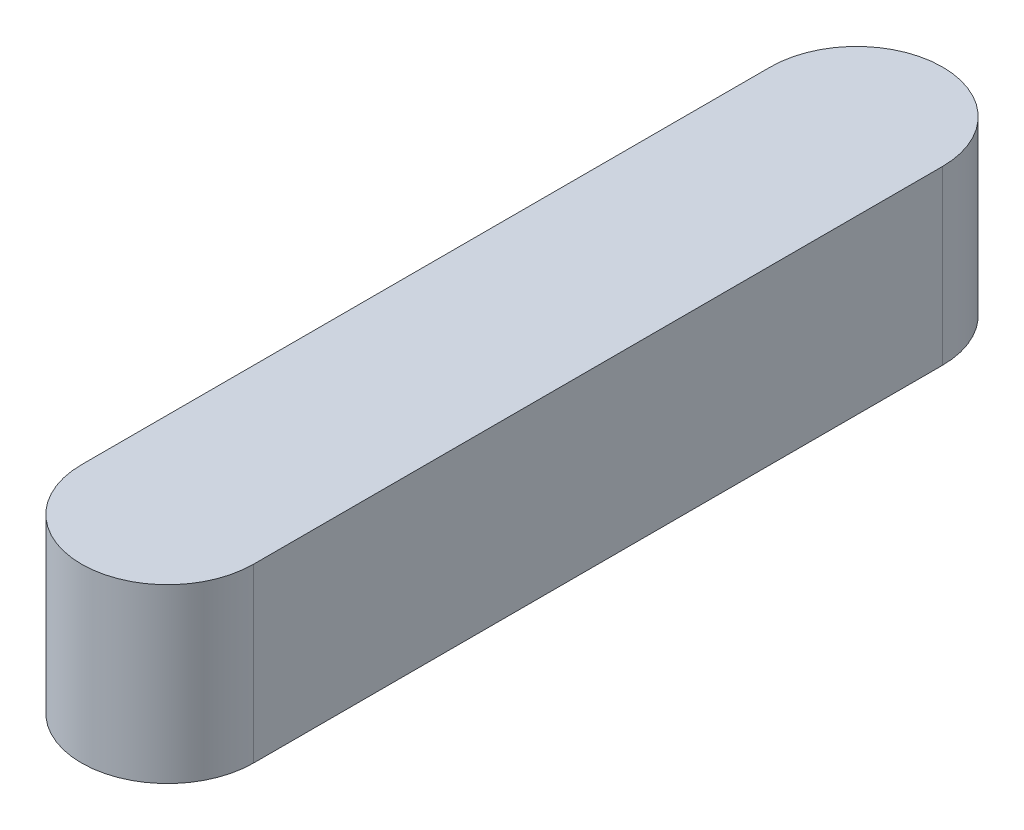
ISO-10303-21;
HEADER;
FILE_DESCRIPTION(('STEP AP214'),'2;1');
FILE_NAME('part.step','',(''),(''),'','','');
FILE_SCHEMA(('AUTOMOTIVE_DESIGN { 1 0 10303 214 1 1 1 1 }'));
ENDSEC;
DATA;
#1=APPLICATION_CONTEXT('core data for automotive mechanical design processes');
#2=APPLICATION_PROTOCOL_DEFINITION('international standard','automotive_design',2000,#1);
#3=PRODUCT_CONTEXT('',#1,'mechanical');
#4=PRODUCT('Part','Part','',(#3));
#5=PRODUCT_RELATED_PRODUCT_CATEGORY('part','',(#4));
#6=PRODUCT_DEFINITION_FORMATION('','',#4);
#7=PRODUCT_DEFINITION_CONTEXT('part definition',#1,'design');
#8=PRODUCT_DEFINITION('design','',#6,#7);
#9=PRODUCT_DEFINITION_SHAPE('','',#8);
#10=(LENGTH_UNIT() NAMED_UNIT(*) SI_UNIT(.MILLI.,.METRE.));
#11=(NAMED_UNIT(*) PLANE_ANGLE_UNIT() SI_UNIT($,.RADIAN.));
#12=(NAMED_UNIT(*) SI_UNIT($,.STERADIAN.) SOLID_ANGLE_UNIT());
#13=UNCERTAINTY_MEASURE_WITH_UNIT(LENGTH_MEASURE(1.E-05),#10,'distance_accuracy_value','');
#14=(GEOMETRIC_REPRESENTATION_CONTEXT(3) GLOBAL_UNCERTAINTY_ASSIGNED_CONTEXT((#13)) GLOBAL_UNIT_ASSIGNED_CONTEXT((#10,
#11,#12)) REPRESENTATION_CONTEXT('',''));
#15=CARTESIAN_POINT('',(0.,0.,0.));
#16=DIRECTION('',(0.,0.,1.));
#17=DIRECTION('',(1.,0.,0.));
#18=AXIS2_PLACEMENT_3D('',#15,#16,#17);
#19=CARTESIAN_POINT('',(0.,6.,-12.));
#20=DIRECTION('',(0.,-1.,0.));
#21=DIRECTION('',(0.,0.,-1.));
#22=AXIS2_PLACEMENT_3D('',#19,#20,#21);
#23=CYLINDRICAL_SURFACE('',#22,3.);
#24=CARTESIAN_POINT('',(0.,0.,-12.));
#25=DIRECTION('',(0.,1.,0.));
#26=DIRECTION('',(0.,0.,1.));
#27=AXIS2_PLACEMENT_3D('',#24,#25,#26);
#28=CIRCLE('',#27,3.);
#29=CARTESIAN_POINT('',(3.,0.,-12.));
#30=VERTEX_POINT('',#29);
#31=CARTESIAN_POINT('',(-3.,0.,-12.));
#32=VERTEX_POINT('',#31);
#33=EDGE_CURVE('E113',#30,#32,#28,.T.);
#34=ORIENTED_EDGE('',*,*,#33,.T.);
#35=DIRECTION('',(0.,-1.,0.));
#36=VECTOR('',#35,1.);
#37=CARTESIAN_POINT('',(-3.,6.,-12.));
#38=LINE('',#37,#36);
#39=CARTESIAN_POINT('',(-3.,6.,-12.));
#40=VERTEX_POINT('',#39);
#41=EDGE_CURVE('E11',#40,#32,#38,.T.);
#42=ORIENTED_EDGE('',*,*,#41,.F.);
#43=CARTESIAN_POINT('',(0.,6.,-12.));
#44=DIRECTION('',(0.,1.,0.));
#45=DIRECTION('',(0.,0.,1.));
#46=AXIS2_PLACEMENT_3D('',#43,#44,#45);
#47=CIRCLE('',#46,3.);
#48=CARTESIAN_POINT('',(3.,6.,-12.));
#49=VERTEX_POINT('',#48);
#50=EDGE_CURVE('E95',#49,#40,#47,.T.);
#51=ORIENTED_EDGE('',*,*,#50,.F.);
#52=DIRECTION('',(0.,-1.,0.));
#53=VECTOR('',#52,1.);
#54=CARTESIAN_POINT('',(3.,6.,-12.));
#55=LINE('',#54,#53);
#56=EDGE_CURVE('E62',#49,#30,#55,.T.);
#57=ORIENTED_EDGE('',*,*,#56,.T.);
#58=EDGE_LOOP('',(#34,#42,#51,#57));
#59=FACE_BOUND('',#58,.T.);
#60=ADVANCED_FACE('F45',(#59),#23,.T.);
#61=CARTESIAN_POINT('',(-3.,6.,-12.));
#62=DIRECTION('',(1.,0.,0.));
#63=DIRECTION('',(0.,0.,-1.));
#64=AXIS2_PLACEMENT_3D('',#61,#62,#63);
#65=PLANE('',#64);
#66=DIRECTION('',(0.,0.,1.));
#67=VECTOR('',#66,1.);
#68=CARTESIAN_POINT('',(-3.,0.,-12.));
#69=LINE('',#68,#67);
#70=CARTESIAN_POINT('',(-3.,0.,12.));
#71=VERTEX_POINT('',#70);
#72=EDGE_CURVE('E101',#32,#71,#69,.T.);
#73=ORIENTED_EDGE('',*,*,#72,.T.);
#74=DIRECTION('',(0.,-1.,0.));
#75=VECTOR('',#74,1.);
#76=CARTESIAN_POINT('',(-3.,6.,12.));
#77=LINE('',#76,#75);
#78=CARTESIAN_POINT('',(-3.,6.,12.));
#79=VERTEX_POINT('',#78);
#80=EDGE_CURVE('E54',#79,#71,#77,.T.);
#81=ORIENTED_EDGE('',*,*,#80,.F.);
#82=DIRECTION('',(0.,0.,1.));
#83=VECTOR('',#82,1.);
#84=CARTESIAN_POINT('',(-3.,6.,-12.));
#85=LINE('',#84,#83);
#86=EDGE_CURVE('E88',#40,#79,#85,.T.);
#87=ORIENTED_EDGE('',*,*,#86,.F.);
#88=ORIENTED_EDGE('',*,*,#41,.T.);
#89=EDGE_LOOP('',(#73,#81,#87,#88));
#90=FACE_BOUND('',#89,.T.);
#91=ADVANCED_FACE('F100',(#90),#65,.F.);
#92=CARTESIAN_POINT('',(0.,6.,12.));
#93=DIRECTION('',(0.,-1.,0.));
#94=DIRECTION('',(0.,0.,-1.));
#95=AXIS2_PLACEMENT_3D('',#92,#93,#94);
#96=CYLINDRICAL_SURFACE('',#95,3.);
#97=CARTESIAN_POINT('',(0.,0.,12.));
#98=DIRECTION('',(0.,1.,0.));
#99=DIRECTION('',(0.,0.,1.));
#100=AXIS2_PLACEMENT_3D('',#97,#98,#99);
#101=CIRCLE('',#100,3.);
#102=CARTESIAN_POINT('',(3.,0.,12.));
#103=VERTEX_POINT('',#102);
#104=EDGE_CURVE('E118',#71,#103,#101,.T.);
#105=ORIENTED_EDGE('',*,*,#104,.T.);
#106=DIRECTION('',(0.,-1.,0.));
#107=VECTOR('',#106,1.);
#108=CARTESIAN_POINT('',(3.,6.,12.));
#109=LINE('',#108,#107);
#110=CARTESIAN_POINT('',(3.,6.,12.));
#111=VERTEX_POINT('',#110);
#112=EDGE_CURVE('E77',#111,#103,#109,.T.);
#113=ORIENTED_EDGE('',*,*,#112,.F.);
#114=CARTESIAN_POINT('',(0.,6.,12.));
#115=DIRECTION('',(0.,1.,0.));
#116=DIRECTION('',(0.,0.,1.));
#117=AXIS2_PLACEMENT_3D('',#114,#115,#116);
#118=CIRCLE('',#117,3.);
#119=EDGE_CURVE('E94',#79,#111,#118,.T.);
#120=ORIENTED_EDGE('',*,*,#119,.F.);
#121=ORIENTED_EDGE('',*,*,#80,.T.);
#122=EDGE_LOOP('',(#105,#113,#120,#121));
#123=FACE_BOUND('',#122,.T.);
#124=ADVANCED_FACE('F105',(#123),#96,.T.);
#125=CARTESIAN_POINT('',(3.,6.,-12.));
#126=DIRECTION('',(1.,0.,0.));
#127=DIRECTION('',(0.,0.,-1.));
#128=AXIS2_PLACEMENT_3D('',#125,#126,#127);
#129=PLANE('',#128);
#130=DIRECTION('',(0.,0.,1.));
#131=VECTOR('',#130,1.);
#132=CARTESIAN_POINT('',(3.,0.,-12.));
#133=LINE('',#132,#131);
#134=EDGE_CURVE('E121',#30,#103,#133,.T.);
#135=ORIENTED_EDGE('',*,*,#134,.F.);
#136=ORIENTED_EDGE('',*,*,#56,.F.);
#137=DIRECTION('',(0.,0.,1.));
#138=VECTOR('',#137,1.);
#139=CARTESIAN_POINT('',(3.,6.,-12.));
#140=LINE('',#139,#138);
#141=EDGE_CURVE('E107',#49,#111,#140,.T.);
#142=ORIENTED_EDGE('',*,*,#141,.T.);
#143=ORIENTED_EDGE('',*,*,#112,.T.);
#144=EDGE_LOOP('',(#135,#136,#142,#143));
#145=FACE_BOUND('',#144,.T.);
#146=ADVANCED_FACE('F131',(#145),#129,.T.);
#147=CARTESIAN_POINT('',(0.,6.,-12.));
#148=DIRECTION('',(0.,1.,0.));
#149=DIRECTION('',(0.,0.,1.));
#150=AXIS2_PLACEMENT_3D('',#147,#148,#149);
#151=PLANE('',#150);
#152=ORIENTED_EDGE('',*,*,#50,.T.);
#153=ORIENTED_EDGE('',*,*,#86,.T.);
#154=ORIENTED_EDGE('',*,*,#119,.T.);
#155=ORIENTED_EDGE('',*,*,#141,.F.);
#156=EDGE_LOOP('',(#152,#153,#154,#155));
#157=FACE_BOUND('',#156,.T.);
#158=ADVANCED_FACE('F91',(#157),#151,.T.);
#159=CARTESIAN_POINT('',(0.,0.,-12.));
#160=DIRECTION('',(0.,1.,0.));
#161=DIRECTION('',(0.,0.,1.));
#162=AXIS2_PLACEMENT_3D('',#159,#160,#161);
#163=PLANE('',#162);
#164=ORIENTED_EDGE('',*,*,#33,.F.);
#165=ORIENTED_EDGE('',*,*,#134,.T.);
#166=ORIENTED_EDGE('',*,*,#104,.F.);
#167=ORIENTED_EDGE('',*,*,#72,.F.);
#168=EDGE_LOOP('',(#164,#165,#166,#167));
#169=FACE_BOUND('',#168,.T.);
#170=ADVANCED_FACE('F130',(#169),#163,.F.);
#171=CLOSED_SHELL('',(#60,#91,#124,#146,#158,#170));
#172=MANIFOLD_SOLID_BREP('B2',#171);
#173=ADVANCED_BREP_SHAPE_REPRESENTATION('',(#18,#172),#14);
#174=SHAPE_DEFINITION_REPRESENTATION(#9,#173);
ENDSEC;
END-ISO-10303-21;
